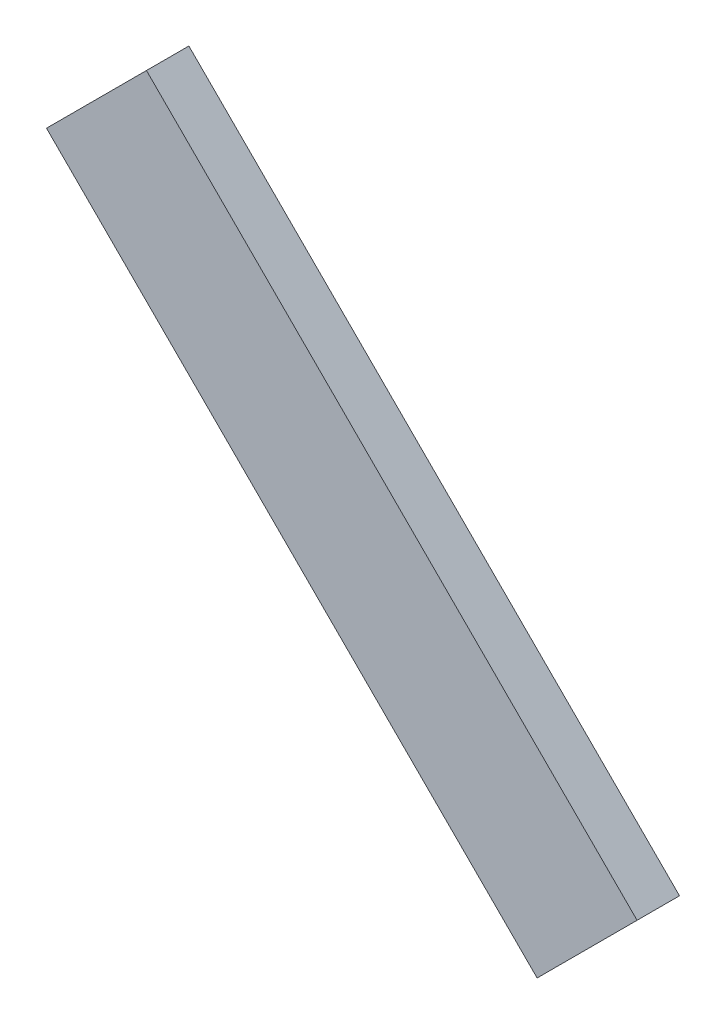
ISO-10303-21;
HEADER;
FILE_DESCRIPTION(('STEP AP214'),'2;1');
FILE_NAME('part.step','',(''),(''),'','','');
FILE_SCHEMA(('AUTOMOTIVE_DESIGN { 1 0 10303 214 1 1 1 1 }'));
ENDSEC;
DATA;
#1=APPLICATION_CONTEXT('core data for automotive mechanical design processes');
#2=APPLICATION_PROTOCOL_DEFINITION('international standard','automotive_design',2000,#1);
#3=PRODUCT_CONTEXT('',#1,'mechanical');
#4=PRODUCT('Part','Part','',(#3));
#5=PRODUCT_RELATED_PRODUCT_CATEGORY('part','',(#4));
#6=PRODUCT_DEFINITION_FORMATION('','',#4);
#7=PRODUCT_DEFINITION_CONTEXT('part definition',#1,'design');
#8=PRODUCT_DEFINITION('design','',#6,#7);
#9=PRODUCT_DEFINITION_SHAPE('','',#8);
#10=(LENGTH_UNIT() NAMED_UNIT(*) SI_UNIT(.MILLI.,.METRE.));
#11=(NAMED_UNIT(*) PLANE_ANGLE_UNIT() SI_UNIT($,.RADIAN.));
#12=(NAMED_UNIT(*) SI_UNIT($,.STERADIAN.) SOLID_ANGLE_UNIT());
#13=UNCERTAINTY_MEASURE_WITH_UNIT(LENGTH_MEASURE(1.E-05),#10,'distance_accuracy_value','');
#14=(GEOMETRIC_REPRESENTATION_CONTEXT(3) GLOBAL_UNCERTAINTY_ASSIGNED_CONTEXT((#13)) GLOBAL_UNIT_ASSIGNED_CONTEXT((#10,
#11,#12)) REPRESENTATION_CONTEXT('',''));
#15=CARTESIAN_POINT('',(0.,0.,0.));
#16=DIRECTION('',(0.,0.,1.));
#17=DIRECTION('',(1.,0.,0.));
#18=AXIS2_PLACEMENT_3D('',#15,#16,#17);
#19=CARTESIAN_POINT('',(105.922845502482,85.3462122563038,3.));
#20=DIRECTION('',(0.707106781186551,-0.707106781186544,0.));
#21=DIRECTION('',(0.707106781186544,0.707106781186551,0.));
#22=AXIS2_PLACEMENT_3D('',#19,#20,#21);
#23=PLANE('',#22);
#24=DIRECTION('',(-0.707106781186544,-0.707106781186551,0.));
#25=VECTOR('',#24,1.);
#26=CARTESIAN_POINT('',(105.922845502482,85.3462122563038,0.));
#27=LINE('',#26,#25);
#28=CARTESIAN_POINT('',(105.922845502482,85.3462122563038,0.));
#29=VERTEX_POINT('',#28);
#30=CARTESIAN_POINT('',(98.8517776906163,78.2751444444382,0.));
#31=VERTEX_POINT('',#30);
#32=EDGE_CURVE('E96',#29,#31,#27,.T.);
#33=ORIENTED_EDGE('',*,*,#32,.T.);
#34=DIRECTION('',(0.,0.,-1.));
#35=VECTOR('',#34,1.);
#36=CARTESIAN_POINT('',(98.8517776906163,78.2751444444382,3.));
#37=LINE('',#36,#35);
#38=CARTESIAN_POINT('',(98.8517776906163,78.2751444444382,3.));
#39=VERTEX_POINT('',#38);
#40=EDGE_CURVE('E11',#39,#31,#37,.T.);
#41=ORIENTED_EDGE('',*,*,#40,.F.);
#42=DIRECTION('',(-0.707106781186544,-0.707106781186551,0.));
#43=VECTOR('',#42,1.);
#44=CARTESIAN_POINT('',(105.922845502482,85.3462122563038,3.));
#45=LINE('',#44,#43);
#46=CARTESIAN_POINT('',(105.922845502482,85.3462122563038,3.));
#47=VERTEX_POINT('',#46);
#48=EDGE_CURVE('E84',#47,#39,#45,.T.);
#49=ORIENTED_EDGE('',*,*,#48,.F.);
#50=DIRECTION('',(0.,0.,-1.));
#51=VECTOR('',#50,1.);
#52=CARTESIAN_POINT('',(105.922845502482,85.3462122563038,3.));
#53=LINE('',#52,#51);
#54=EDGE_CURVE('E92',#47,#29,#53,.T.);
#55=ORIENTED_EDGE('',*,*,#54,.T.);
#56=EDGE_LOOP('',(#33,#41,#49,#55));
#57=FACE_BOUND('',#56,.T.);
#58=ADVANCED_FACE('F33',(#57),#23,.F.);
#59=CARTESIAN_POINT('',(98.8517776906163,78.2751444444382,3.));
#60=DIRECTION('',(0.707106781186548,0.707106781186547,0.));
#61=DIRECTION('',(-0.707106781186547,0.707106781186548,0.));
#62=AXIS2_PLACEMENT_3D('',#59,#60,#61);
#63=PLANE('',#62);
#64=DIRECTION('',(0.707106781186547,-0.707106781186548,0.));
#65=VECTOR('',#64,1.);
#66=CARTESIAN_POINT('',(98.8517776906163,78.2751444444382,0.));
#67=LINE('',#66,#65);
#68=CARTESIAN_POINT('',(133.556578511252,43.5703436238025,0.));
#69=VERTEX_POINT('',#68);
#70=EDGE_CURVE('E88',#31,#69,#67,.T.);
#71=ORIENTED_EDGE('',*,*,#70,.T.);
#72=DIRECTION('',(0.,0.,-1.));
#73=VECTOR('',#72,1.);
#74=CARTESIAN_POINT('',(133.556578511252,43.5703436238025,3.));
#75=LINE('',#74,#73);
#76=CARTESIAN_POINT('',(133.556578511252,43.5703436238025,3.));
#77=VERTEX_POINT('',#76);
#78=EDGE_CURVE('E41',#77,#69,#75,.T.);
#79=ORIENTED_EDGE('',*,*,#78,.F.);
#80=DIRECTION('',(0.707106781186547,-0.707106781186548,0.));
#81=VECTOR('',#80,1.);
#82=CARTESIAN_POINT('',(98.8517776906163,78.2751444444382,3.));
#83=LINE('',#82,#81);
#84=EDGE_CURVE('E79',#39,#77,#83,.T.);
#85=ORIENTED_EDGE('',*,*,#84,.F.);
#86=ORIENTED_EDGE('',*,*,#40,.T.);
#87=EDGE_LOOP('',(#71,#79,#85,#86));
#88=FACE_BOUND('',#87,.T.);
#89=ADVANCED_FACE('F87',(#88),#63,.F.);
#90=CARTESIAN_POINT('',(133.556578511252,43.5703436238025,3.));
#91=DIRECTION('',(-0.707106781186579,0.707106781186517,0.));
#92=DIRECTION('',(-0.707106781186517,-0.707106781186579,0.));
#93=AXIS2_PLACEMENT_3D('',#90,#91,#92);
#94=PLANE('',#93);
#95=DIRECTION('',(0.707106781186517,0.707106781186578,0.));
#96=VECTOR('',#95,1.);
#97=CARTESIAN_POINT('',(133.556578511252,43.5703436238025,0.));
#98=LINE('',#97,#96);
#99=CARTESIAN_POINT('',(140.627646323117,50.6414114356683,0.));
#100=VERTEX_POINT('',#99);
#101=EDGE_CURVE('E66',#69,#100,#98,.T.);
#102=ORIENTED_EDGE('',*,*,#101,.T.);
#103=DIRECTION('',(0.,0.,-1.));
#104=VECTOR('',#103,1.);
#105=CARTESIAN_POINT('',(140.627646323117,50.6414114356683,3.));
#106=LINE('',#105,#104);
#107=CARTESIAN_POINT('',(140.627646323117,50.6414114356683,3.));
#108=VERTEX_POINT('',#107);
#109=EDGE_CURVE('E89',#108,#100,#106,.T.);
#110=ORIENTED_EDGE('',*,*,#109,.F.);
#111=DIRECTION('',(0.707106781186517,0.707106781186578,0.));
#112=VECTOR('',#111,1.);
#113=CARTESIAN_POINT('',(133.556578511252,43.5703436238025,3.));
#114=LINE('',#113,#112);
#115=EDGE_CURVE('E82',#77,#108,#114,.T.);
#116=ORIENTED_EDGE('',*,*,#115,.F.);
#117=ORIENTED_EDGE('',*,*,#78,.T.);
#118=EDGE_LOOP('',(#102,#110,#116,#117));
#119=FACE_BOUND('',#118,.T.);
#120=ADVANCED_FACE('F90',(#119),#94,.F.);
#121=CARTESIAN_POINT('',(105.922845502482,85.3462122563038,3.));
#122=DIRECTION('',(-0.707106781186549,-0.707106781186547,0.));
#123=DIRECTION('',(0.707106781186547,-0.707106781186549,0.));
#124=AXIS2_PLACEMENT_3D('',#121,#122,#123);
#125=PLANE('',#124);
#126=DIRECTION('',(-0.707106781186546,0.707106781186548,0.));
#127=VECTOR('',#126,1.);
#128=CARTESIAN_POINT('',(105.922845502482,85.3462122563038,0.));
#129=LINE('',#128,#127);
#130=EDGE_CURVE('E72',#100,#29,#129,.T.);
#131=ORIENTED_EDGE('',*,*,#130,.T.);
#132=ORIENTED_EDGE('',*,*,#54,.F.);
#133=DIRECTION('',(-0.707106781186546,0.707106781186548,0.));
#134=VECTOR('',#133,1.);
#135=CARTESIAN_POINT('',(105.922845502482,85.3462122563038,3.));
#136=LINE('',#135,#134);
#137=EDGE_CURVE('E49',#108,#47,#136,.T.);
#138=ORIENTED_EDGE('',*,*,#137,.F.);
#139=ORIENTED_EDGE('',*,*,#109,.T.);
#140=EDGE_LOOP('',(#131,#132,#138,#139));
#141=FACE_BOUND('',#140,.T.);
#142=ADVANCED_FACE('F103',(#141),#125,.F.);
#143=CARTESIAN_POINT('',(0.,0.,3.));
#144=DIRECTION('',(0.,0.,1.));
#145=DIRECTION('',(1.,0.,0.));
#146=AXIS2_PLACEMENT_3D('',#143,#144,#145);
#147=PLANE('',#146);
#148=ORIENTED_EDGE('',*,*,#48,.T.);
#149=ORIENTED_EDGE('',*,*,#84,.T.);
#150=ORIENTED_EDGE('',*,*,#115,.T.);
#151=ORIENTED_EDGE('',*,*,#137,.T.);
#152=EDGE_LOOP('',(#148,#149,#150,#151));
#153=FACE_BOUND('',#152,.T.);
#154=ADVANCED_FACE('F80',(#153),#147,.T.);
#155=CARTESIAN_POINT('',(0.,0.,0.));
#156=DIRECTION('',(0.,0.,1.));
#157=DIRECTION('',(1.,0.,0.));
#158=AXIS2_PLACEMENT_3D('',#155,#156,#157);
#159=PLANE('',#158);
#160=ORIENTED_EDGE('',*,*,#32,.F.);
#161=ORIENTED_EDGE('',*,*,#130,.F.);
#162=ORIENTED_EDGE('',*,*,#101,.F.);
#163=ORIENTED_EDGE('',*,*,#70,.F.);
#164=EDGE_LOOP('',(#160,#161,#162,#163));
#165=FACE_BOUND('',#164,.T.);
#166=ADVANCED_FACE('F106',(#165),#159,.F.);
#167=CLOSED_SHELL('',(#58,#89,#120,#142,#154,#166));
#168=MANIFOLD_SOLID_BREP('B2',#167);
#169=ADVANCED_BREP_SHAPE_REPRESENTATION('',(#18,#168),#14);
#170=SHAPE_DEFINITION_REPRESENTATION(#9,#169);
ENDSEC;
END-ISO-10303-21;
